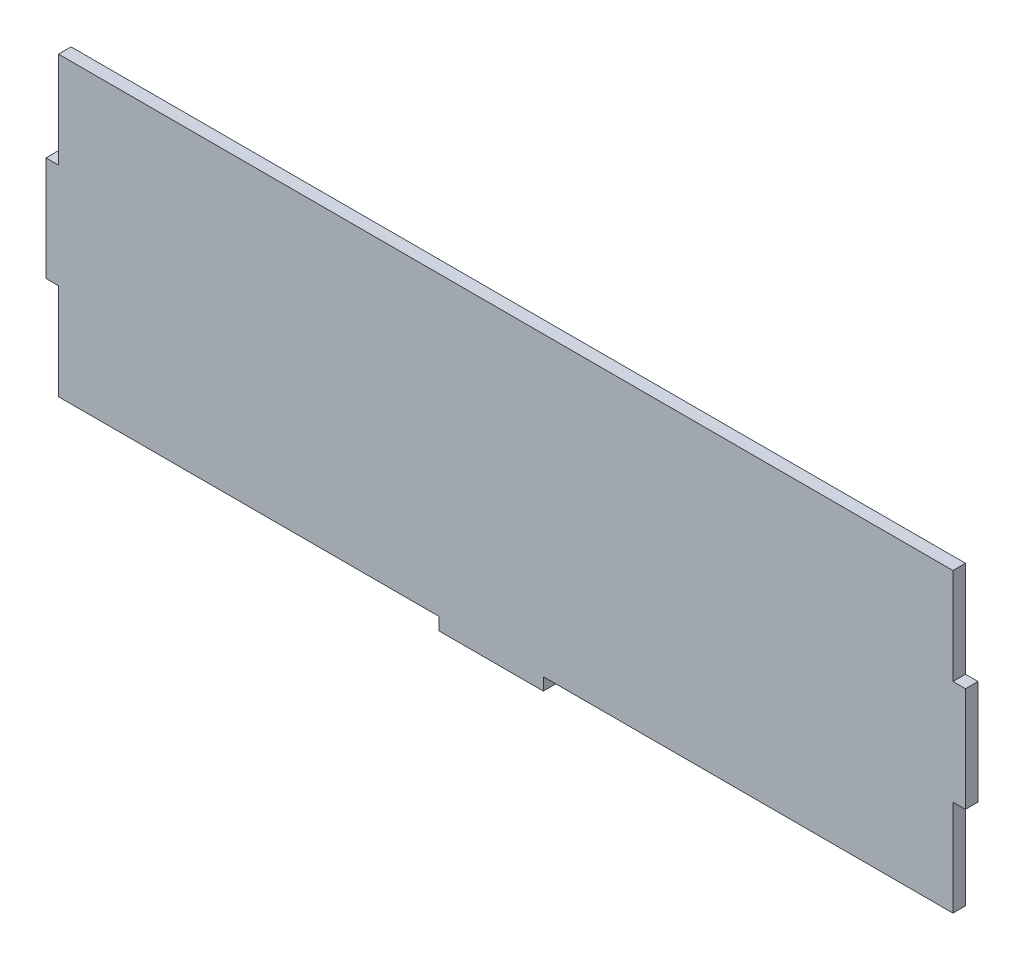
ISO-10303-21;
HEADER;
FILE_DESCRIPTION(('STEP AP214'),'2;1');
FILE_NAME('part.step','',(''),(''),'','','');
FILE_SCHEMA(('AUTOMOTIVE_DESIGN { 1 0 10303 214 1 1 1 1 }'));
ENDSEC;
DATA;
#1=APPLICATION_CONTEXT('core data for automotive mechanical design processes');
#2=APPLICATION_PROTOCOL_DEFINITION('international standard','automotive_design',2000,#1);
#3=PRODUCT_CONTEXT('',#1,'mechanical');
#4=PRODUCT('Part','Part','',(#3));
#5=PRODUCT_RELATED_PRODUCT_CATEGORY('part','',(#4));
#6=PRODUCT_DEFINITION_FORMATION('','',#4);
#7=PRODUCT_DEFINITION_CONTEXT('part definition',#1,'design');
#8=PRODUCT_DEFINITION('design','',#6,#7);
#9=PRODUCT_DEFINITION_SHAPE('','',#8);
#10=(LENGTH_UNIT() NAMED_UNIT(*) SI_UNIT(.MILLI.,.METRE.));
#11=(NAMED_UNIT(*) PLANE_ANGLE_UNIT() SI_UNIT($,.RADIAN.));
#12=(NAMED_UNIT(*) SI_UNIT($,.STERADIAN.) SOLID_ANGLE_UNIT());
#13=UNCERTAINTY_MEASURE_WITH_UNIT(LENGTH_MEASURE(1.E-05),#10,'distance_accuracy_value','');
#14=(GEOMETRIC_REPRESENTATION_CONTEXT(3) GLOBAL_UNCERTAINTY_ASSIGNED_CONTEXT((#13)) GLOBAL_UNIT_ASSIGNED_CONTEXT((#10,
#11,#12)) REPRESENTATION_CONTEXT('',''));
#15=CARTESIAN_POINT('',(0.,0.,0.));
#16=DIRECTION('',(0.,0.,1.));
#17=DIRECTION('',(1.,0.,0.));
#18=AXIS2_PLACEMENT_3D('',#15,#16,#17);
#19=CARTESIAN_POINT('',(0.,0.,6.));
#20=DIRECTION('',(1.,0.,0.));
#21=DIRECTION('',(0.,1.,0.));
#22=AXIS2_PLACEMENT_3D('',#19,#20,#21);
#23=PLANE('',#22);
#24=DIRECTION('',(0.,-1.,0.));
#25=VECTOR('',#24,1.);
#26=CARTESIAN_POINT('',(0.,0.,0.));
#27=LINE('',#26,#25);
#28=CARTESIAN_POINT('',(0.,0.,0.));
#29=VERTEX_POINT('',#28);
#30=CARTESIAN_POINT('',(0.,-46.,0.));
#31=VERTEX_POINT('',#30);
#32=EDGE_CURVE('E179',#29,#31,#27,.T.);
#33=ORIENTED_EDGE('',*,*,#32,.T.);
#34=DIRECTION('',(0.,0.,-1.));
#35=VECTOR('',#34,1.);
#36=CARTESIAN_POINT('',(0.,-46.,6.));
#37=LINE('',#36,#35);
#38=CARTESIAN_POINT('',(0.,-46.,6.));
#39=VERTEX_POINT('',#38);
#40=EDGE_CURVE('E11',#39,#31,#37,.T.);
#41=ORIENTED_EDGE('',*,*,#40,.F.);
#42=DIRECTION('',(0.,-1.,0.));
#43=VECTOR('',#42,1.);
#44=CARTESIAN_POINT('',(0.,0.,6.));
#45=LINE('',#44,#43);
#46=CARTESIAN_POINT('',(0.,0.,6.));
#47=VERTEX_POINT('',#46);
#48=EDGE_CURVE('E209',#47,#39,#45,.T.);
#49=ORIENTED_EDGE('',*,*,#48,.F.);
#50=DIRECTION('',(0.,0.,-1.));
#51=VECTOR('',#50,1.);
#52=CARTESIAN_POINT('',(0.,0.,6.));
#53=LINE('',#52,#51);
#54=EDGE_CURVE('E175',#47,#29,#53,.T.);
#55=ORIENTED_EDGE('',*,*,#54,.T.);
#56=EDGE_LOOP('',(#33,#41,#49,#55));
#57=FACE_BOUND('',#56,.T.);
#58=ADVANCED_FACE('F35',(#57),#23,.F.);
#59=CARTESIAN_POINT('',(-5.99999999999999,-46.,6.));
#60=DIRECTION('',(0.,-1.,0.));
#61=DIRECTION('',(0.,0.,-1.));
#62=AXIS2_PLACEMENT_3D('',#59,#60,#61);
#63=PLANE('',#62);
#64=DIRECTION('',(-1.,0.,0.));
#65=VECTOR('',#64,1.);
#66=CARTESIAN_POINT('',(-5.99999999999999,-46.,0.));
#67=LINE('',#66,#65);
#68=CARTESIAN_POINT('',(-5.99999999999999,-46.,0.));
#69=VERTEX_POINT('',#68);
#70=EDGE_CURVE('E182',#31,#69,#67,.T.);
#71=ORIENTED_EDGE('',*,*,#70,.T.);
#72=DIRECTION('',(0.,0.,-1.));
#73=VECTOR('',#72,1.);
#74=CARTESIAN_POINT('',(-5.99999999999999,-46.,6.));
#75=LINE('',#74,#73);
#76=CARTESIAN_POINT('',(-5.99999999999999,-46.,6.));
#77=VERTEX_POINT('',#76);
#78=EDGE_CURVE('E43',#77,#69,#75,.T.);
#79=ORIENTED_EDGE('',*,*,#78,.F.);
#80=DIRECTION('',(-1.,0.,0.));
#81=VECTOR('',#80,1.);
#82=CARTESIAN_POINT('',(-5.99999999999999,-46.,6.));
#83=LINE('',#82,#81);
#84=EDGE_CURVE('E118',#39,#77,#83,.T.);
#85=ORIENTED_EDGE('',*,*,#84,.F.);
#86=ORIENTED_EDGE('',*,*,#40,.T.);
#87=EDGE_LOOP('',(#71,#79,#85,#86));
#88=FACE_BOUND('',#87,.T.);
#89=ADVANCED_FACE('F307',(#88),#63,.F.);
#90=CARTESIAN_POINT('',(-5.99999999999999,-46.,6.));
#91=DIRECTION('',(1.,0.,0.));
#92=DIRECTION('',(0.,1.,0.));
#93=AXIS2_PLACEMENT_3D('',#90,#91,#92);
#94=PLANE('',#93);
#95=DIRECTION('',(0.,-1.,0.));
#96=VECTOR('',#95,1.);
#97=CARTESIAN_POINT('',(-5.99999999999999,-46.,0.));
#98=LINE('',#97,#96);
#99=CARTESIAN_POINT('',(-5.99999999999999,-96.,0.));
#100=VERTEX_POINT('',#99);
#101=EDGE_CURVE('E184',#69,#100,#98,.T.);
#102=ORIENTED_EDGE('',*,*,#101,.T.);
#103=DIRECTION('',(0.,0.,-1.));
#104=VECTOR('',#103,1.);
#105=CARTESIAN_POINT('',(-5.99999999999999,-96.,6.));
#106=LINE('',#105,#104);
#107=CARTESIAN_POINT('',(-5.99999999999999,-96.,6.));
#108=VERTEX_POINT('',#107);
#109=EDGE_CURVE('E240',#108,#100,#106,.T.);
#110=ORIENTED_EDGE('',*,*,#109,.F.);
#111=DIRECTION('',(0.,-1.,0.));
#112=VECTOR('',#111,1.);
#113=CARTESIAN_POINT('',(-5.99999999999999,-46.,6.));
#114=LINE('',#113,#112);
#115=EDGE_CURVE('E248',#77,#108,#114,.T.);
#116=ORIENTED_EDGE('',*,*,#115,.F.);
#117=ORIENTED_EDGE('',*,*,#78,.T.);
#118=EDGE_LOOP('',(#102,#110,#116,#117));
#119=FACE_BOUND('',#118,.T.);
#120=ADVANCED_FACE('F246',(#119),#94,.F.);
#121=CARTESIAN_POINT('',(-5.99999999999999,-96.,6.));
#122=DIRECTION('',(0.,1.,0.));
#123=DIRECTION('',(0.,0.,1.));
#124=AXIS2_PLACEMENT_3D('',#121,#122,#123);
#125=PLANE('',#124);
#126=DIRECTION('',(1.,0.,0.));
#127=VECTOR('',#126,1.);
#128=CARTESIAN_POINT('',(-5.99999999999999,-96.,0.));
#129=LINE('',#128,#127);
#130=CARTESIAN_POINT('',(0.,-96.,0.));
#131=VERTEX_POINT('',#130);
#132=EDGE_CURVE('E186',#100,#131,#129,.T.);
#133=ORIENTED_EDGE('',*,*,#132,.T.);
#134=DIRECTION('',(0.,0.,-1.));
#135=VECTOR('',#134,1.);
#136=CARTESIAN_POINT('',(0.,-96.,6.));
#137=LINE('',#136,#135);
#138=CARTESIAN_POINT('',(0.,-96.,6.));
#139=VERTEX_POINT('',#138);
#140=EDGE_CURVE('E237',#139,#131,#137,.T.);
#141=ORIENTED_EDGE('',*,*,#140,.F.);
#142=DIRECTION('',(1.,0.,0.));
#143=VECTOR('',#142,1.);
#144=CARTESIAN_POINT('',(-5.99999999999999,-96.,6.));
#145=LINE('',#144,#143);
#146=EDGE_CURVE('E266',#108,#139,#145,.T.);
#147=ORIENTED_EDGE('',*,*,#146,.F.);
#148=ORIENTED_EDGE('',*,*,#109,.T.);
#149=EDGE_LOOP('',(#133,#141,#147,#148));
#150=FACE_BOUND('',#149,.T.);
#151=ADVANCED_FACE('F257',(#150),#125,.F.);
#152=CARTESIAN_POINT('',(0.,-96.,6.));
#153=DIRECTION('',(1.,0.,0.));
#154=DIRECTION('',(0.,1.,0.));
#155=AXIS2_PLACEMENT_3D('',#152,#153,#154);
#156=PLANE('',#155);
#157=DIRECTION('',(0.,-1.,0.));
#158=VECTOR('',#157,1.);
#159=CARTESIAN_POINT('',(0.,-96.,0.));
#160=LINE('',#159,#158);
#161=CARTESIAN_POINT('',(0.,-142.,0.));
#162=VERTEX_POINT('',#161);
#163=EDGE_CURVE('E188',#131,#162,#160,.T.);
#164=ORIENTED_EDGE('',*,*,#163,.T.);
#165=DIRECTION('',(0.,0.,-1.));
#166=VECTOR('',#165,1.);
#167=CARTESIAN_POINT('',(0.,-142.,6.));
#168=LINE('',#167,#166);
#169=CARTESIAN_POINT('',(0.,-142.,6.));
#170=VERTEX_POINT('',#169);
#171=EDGE_CURVE('E234',#170,#162,#168,.T.);
#172=ORIENTED_EDGE('',*,*,#171,.F.);
#173=DIRECTION('',(0.,-1.,0.));
#174=VECTOR('',#173,1.);
#175=CARTESIAN_POINT('',(0.,-96.,6.));
#176=LINE('',#175,#174);
#177=EDGE_CURVE('E263',#139,#170,#176,.T.);
#178=ORIENTED_EDGE('',*,*,#177,.F.);
#179=ORIENTED_EDGE('',*,*,#140,.T.);
#180=EDGE_LOOP('',(#164,#172,#178,#179));
#181=FACE_BOUND('',#180,.T.);
#182=ADVANCED_FACE('F261',(#181),#156,.F.);
#183=CARTESIAN_POINT('',(182.,-142.,6.));
#184=DIRECTION('',(0.,1.,0.));
#185=DIRECTION('',(-1.,0.,0.));
#186=AXIS2_PLACEMENT_3D('',#183,#184,#185);
#187=PLANE('',#186);
#188=DIRECTION('',(1.,0.,0.));
#189=VECTOR('',#188,1.);
#190=CARTESIAN_POINT('',(182.,-142.,0.));
#191=LINE('',#190,#189);
#192=CARTESIAN_POINT('',(182.,-142.,0.));
#193=VERTEX_POINT('',#192);
#194=EDGE_CURVE('E190',#162,#193,#191,.T.);
#195=ORIENTED_EDGE('',*,*,#194,.T.);
#196=DIRECTION('',(0.,0.,-1.));
#197=VECTOR('',#196,1.);
#198=CARTESIAN_POINT('',(182.,-142.,6.));
#199=LINE('',#198,#197);
#200=CARTESIAN_POINT('',(182.,-142.,6.));
#201=VERTEX_POINT('',#200);
#202=EDGE_CURVE('E231',#201,#193,#199,.T.);
#203=ORIENTED_EDGE('',*,*,#202,.F.);
#204=DIRECTION('',(1.,0.,0.));
#205=VECTOR('',#204,1.);
#206=CARTESIAN_POINT('',(182.,-142.,6.));
#207=LINE('',#206,#205);
#208=EDGE_CURVE('E265',#170,#201,#207,.T.);
#209=ORIENTED_EDGE('',*,*,#208,.F.);
#210=ORIENTED_EDGE('',*,*,#171,.T.);
#211=EDGE_LOOP('',(#195,#203,#209,#210));
#212=FACE_BOUND('',#211,.T.);
#213=ADVANCED_FACE('F320',(#212),#187,.F.);
#214=CARTESIAN_POINT('',(182.,-142.,6.));
#215=DIRECTION('',(1.,0.,0.));
#216=DIRECTION('',(0.,1.,0.));
#217=AXIS2_PLACEMENT_3D('',#214,#215,#216);
#218=PLANE('',#217);
#219=DIRECTION('',(0.,-1.,0.));
#220=VECTOR('',#219,1.);
#221=CARTESIAN_POINT('',(182.,-142.,0.));
#222=LINE('',#221,#220);
#223=CARTESIAN_POINT('',(182.,-148.,0.));
#224=VERTEX_POINT('',#223);
#225=EDGE_CURVE('E192',#193,#224,#222,.T.);
#226=ORIENTED_EDGE('',*,*,#225,.T.);
#227=DIRECTION('',(0.,0.,-1.));
#228=VECTOR('',#227,1.);
#229=CARTESIAN_POINT('',(182.,-148.,6.));
#230=LINE('',#229,#228);
#231=CARTESIAN_POINT('',(182.,-148.,6.));
#232=VERTEX_POINT('',#231);
#233=EDGE_CURVE('E228',#232,#224,#230,.T.);
#234=ORIENTED_EDGE('',*,*,#233,.F.);
#235=DIRECTION('',(0.,-1.,0.));
#236=VECTOR('',#235,1.);
#237=CARTESIAN_POINT('',(182.,-142.,6.));
#238=LINE('',#237,#236);
#239=EDGE_CURVE('E268',#201,#232,#238,.T.);
#240=ORIENTED_EDGE('',*,*,#239,.F.);
#241=ORIENTED_EDGE('',*,*,#202,.T.);
#242=EDGE_LOOP('',(#226,#234,#240,#241));
#243=FACE_BOUND('',#242,.T.);
#244=ADVANCED_FACE('F323',(#243),#218,.F.);
#245=CARTESIAN_POINT('',(182.,-148.,6.));
#246=DIRECTION('',(0.,1.,0.));
#247=DIRECTION('',(0.,0.,1.));
#248=AXIS2_PLACEMENT_3D('',#245,#246,#247);
#249=PLANE('',#248);
#250=DIRECTION('',(1.,0.,0.));
#251=VECTOR('',#250,1.);
#252=CARTESIAN_POINT('',(182.,-148.,0.));
#253=LINE('',#252,#251);
#254=CARTESIAN_POINT('',(232.,-148.,0.));
#255=VERTEX_POINT('',#254);
#256=EDGE_CURVE('E194',#224,#255,#253,.T.);
#257=ORIENTED_EDGE('',*,*,#256,.T.);
#258=DIRECTION('',(0.,0.,-1.));
#259=VECTOR('',#258,1.);
#260=CARTESIAN_POINT('',(232.,-148.,6.));
#261=LINE('',#260,#259);
#262=CARTESIAN_POINT('',(232.,-148.,6.));
#263=VERTEX_POINT('',#262);
#264=EDGE_CURVE('E225',#263,#255,#261,.T.);
#265=ORIENTED_EDGE('',*,*,#264,.F.);
#266=DIRECTION('',(1.,0.,0.));
#267=VECTOR('',#266,1.);
#268=CARTESIAN_POINT('',(182.,-148.,6.));
#269=LINE('',#268,#267);
#270=EDGE_CURVE('E274',#232,#263,#269,.T.);
#271=ORIENTED_EDGE('',*,*,#270,.F.);
#272=ORIENTED_EDGE('',*,*,#233,.T.);
#273=EDGE_LOOP('',(#257,#265,#271,#272));
#274=FACE_BOUND('',#273,.T.);
#275=ADVANCED_FACE('F327',(#274),#249,.F.);
#276=CARTESIAN_POINT('',(232.,-142.,6.));
#277=DIRECTION('',(-1.,0.,0.));
#278=DIRECTION('',(0.,0.,1.));
#279=AXIS2_PLACEMENT_3D('',#276,#277,#278);
#280=PLANE('',#279);
#281=DIRECTION('',(0.,1.,0.));
#282=VECTOR('',#281,1.);
#283=CARTESIAN_POINT('',(232.,-142.,0.));
#284=LINE('',#283,#282);
#285=CARTESIAN_POINT('',(232.,-142.,0.));
#286=VERTEX_POINT('',#285);
#287=EDGE_CURVE('E196',#255,#286,#284,.T.);
#288=ORIENTED_EDGE('',*,*,#287,.T.);
#289=DIRECTION('',(0.,0.,-1.));
#290=VECTOR('',#289,1.);
#291=CARTESIAN_POINT('',(232.,-142.,6.));
#292=LINE('',#291,#290);
#293=CARTESIAN_POINT('',(232.,-142.,6.));
#294=VERTEX_POINT('',#293);
#295=EDGE_CURVE('E222',#294,#286,#292,.T.);
#296=ORIENTED_EDGE('',*,*,#295,.F.);
#297=DIRECTION('',(0.,1.,0.));
#298=VECTOR('',#297,1.);
#299=CARTESIAN_POINT('',(232.,-142.,6.));
#300=LINE('',#299,#298);
#301=EDGE_CURVE('E276',#263,#294,#300,.T.);
#302=ORIENTED_EDGE('',*,*,#301,.F.);
#303=ORIENTED_EDGE('',*,*,#264,.T.);
#304=EDGE_LOOP('',(#288,#296,#302,#303));
#305=FACE_BOUND('',#304,.T.);
#306=ADVANCED_FACE('F331',(#305),#280,.F.);
#307=CARTESIAN_POINT('',(428.,-142.,6.));
#308=DIRECTION('',(0.,1.,0.));
#309=DIRECTION('',(-1.,0.,0.));
#310=AXIS2_PLACEMENT_3D('',#307,#308,#309);
#311=PLANE('',#310);
#312=DIRECTION('',(1.,0.,0.));
#313=VECTOR('',#312,1.);
#314=CARTESIAN_POINT('',(428.,-142.,0.));
#315=LINE('',#314,#313);
#316=CARTESIAN_POINT('',(428.,-142.,0.));
#317=VERTEX_POINT('',#316);
#318=EDGE_CURVE('E198',#286,#317,#315,.T.);
#319=ORIENTED_EDGE('',*,*,#318,.T.);
#320=DIRECTION('',(0.,0.,-1.));
#321=VECTOR('',#320,1.);
#322=CARTESIAN_POINT('',(428.,-142.,6.));
#323=LINE('',#322,#321);
#324=CARTESIAN_POINT('',(428.,-142.,6.));
#325=VERTEX_POINT('',#324);
#326=EDGE_CURVE('E219',#325,#317,#323,.T.);
#327=ORIENTED_EDGE('',*,*,#326,.F.);
#328=DIRECTION('',(1.,0.,0.));
#329=VECTOR('',#328,1.);
#330=CARTESIAN_POINT('',(428.,-142.,6.));
#331=LINE('',#330,#329);
#332=EDGE_CURVE('E278',#294,#325,#331,.T.);
#333=ORIENTED_EDGE('',*,*,#332,.F.);
#334=ORIENTED_EDGE('',*,*,#295,.T.);
#335=EDGE_LOOP('',(#319,#327,#333,#334));
#336=FACE_BOUND('',#335,.T.);
#337=ADVANCED_FACE('F335',(#336),#311,.F.);
#338=CARTESIAN_POINT('',(428.,-95.9999999999999,6.));
#339=DIRECTION('',(-1.,0.,0.));
#340=DIRECTION('',(0.,0.,1.));
#341=AXIS2_PLACEMENT_3D('',#338,#339,#340);
#342=PLANE('',#341);
#343=DIRECTION('',(0.,1.,0.));
#344=VECTOR('',#343,1.);
#345=CARTESIAN_POINT('',(428.,-95.9999999999999,0.));
#346=LINE('',#345,#344);
#347=CARTESIAN_POINT('',(428.,-95.9999999999999,0.));
#348=VERTEX_POINT('',#347);
#349=EDGE_CURVE('E200',#317,#348,#346,.T.);
#350=ORIENTED_EDGE('',*,*,#349,.T.);
#351=DIRECTION('',(0.,0.,-1.));
#352=VECTOR('',#351,1.);
#353=CARTESIAN_POINT('',(428.,-95.9999999999999,6.));
#354=LINE('',#353,#352);
#355=CARTESIAN_POINT('',(428.,-95.9999999999999,6.));
#356=VERTEX_POINT('',#355);
#357=EDGE_CURVE('E216',#356,#348,#354,.T.);
#358=ORIENTED_EDGE('',*,*,#357,.F.);
#359=DIRECTION('',(0.,1.,0.));
#360=VECTOR('',#359,1.);
#361=CARTESIAN_POINT('',(428.,-95.9999999999999,6.));
#362=LINE('',#361,#360);
#363=EDGE_CURVE('E280',#325,#356,#362,.T.);
#364=ORIENTED_EDGE('',*,*,#363,.F.);
#365=ORIENTED_EDGE('',*,*,#326,.T.);
#366=EDGE_LOOP('',(#350,#358,#364,#365));
#367=FACE_BOUND('',#366,.T.);
#368=ADVANCED_FACE('F339',(#367),#342,.F.);
#369=CARTESIAN_POINT('',(434.,-95.9999999999999,6.));
#370=DIRECTION('',(0.,1.,0.));
#371=DIRECTION('',(0.,0.,1.));
#372=AXIS2_PLACEMENT_3D('',#369,#370,#371);
#373=PLANE('',#372);
#374=DIRECTION('',(1.,0.,0.));
#375=VECTOR('',#374,1.);
#376=CARTESIAN_POINT('',(434.,-95.9999999999999,0.));
#377=LINE('',#376,#375);
#378=CARTESIAN_POINT('',(434.,-95.9999999999999,0.));
#379=VERTEX_POINT('',#378);
#380=EDGE_CURVE('E202',#348,#379,#377,.T.);
#381=ORIENTED_EDGE('',*,*,#380,.T.);
#382=DIRECTION('',(0.,0.,-1.));
#383=VECTOR('',#382,1.);
#384=CARTESIAN_POINT('',(434.,-95.9999999999999,6.));
#385=LINE('',#384,#383);
#386=CARTESIAN_POINT('',(434.,-95.9999999999999,6.));
#387=VERTEX_POINT('',#386);
#388=EDGE_CURVE('E213',#387,#379,#385,.T.);
#389=ORIENTED_EDGE('',*,*,#388,.F.);
#390=DIRECTION('',(1.,0.,0.));
#391=VECTOR('',#390,1.);
#392=CARTESIAN_POINT('',(434.,-95.9999999999999,6.));
#393=LINE('',#392,#391);
#394=EDGE_CURVE('E282',#356,#387,#393,.T.);
#395=ORIENTED_EDGE('',*,*,#394,.F.);
#396=ORIENTED_EDGE('',*,*,#357,.T.);
#397=EDGE_LOOP('',(#381,#389,#395,#396));
#398=FACE_BOUND('',#397,.T.);
#399=ADVANCED_FACE('F288',(#398),#373,.F.);
#400=CARTESIAN_POINT('',(434.,-45.9999999999999,6.));
#401=DIRECTION('',(-1.,0.,0.));
#402=DIRECTION('',(0.,-1.,0.));
#403=AXIS2_PLACEMENT_3D('',#400,#401,#402);
#404=PLANE('',#403);
#405=DIRECTION('',(0.,1.,0.));
#406=VECTOR('',#405,1.);
#407=CARTESIAN_POINT('',(434.,-45.9999999999999,0.));
#408=LINE('',#407,#406);
#409=CARTESIAN_POINT('',(434.,-45.9999999999999,0.));
#410=VERTEX_POINT('',#409);
#411=EDGE_CURVE('E204',#379,#410,#408,.T.);
#412=ORIENTED_EDGE('',*,*,#411,.T.);
#413=DIRECTION('',(0.,0.,-1.));
#414=VECTOR('',#413,1.);
#415=CARTESIAN_POINT('',(434.,-45.9999999999999,6.));
#416=LINE('',#415,#414);
#417=CARTESIAN_POINT('',(434.,-45.9999999999999,6.));
#418=VERTEX_POINT('',#417);
#419=EDGE_CURVE('E170',#418,#410,#416,.T.);
#420=ORIENTED_EDGE('',*,*,#419,.F.);
#421=DIRECTION('',(0.,1.,0.));
#422=VECTOR('',#421,1.);
#423=CARTESIAN_POINT('',(434.,-45.9999999999999,6.));
#424=LINE('',#423,#422);
#425=EDGE_CURVE('E161',#387,#418,#424,.T.);
#426=ORIENTED_EDGE('',*,*,#425,.F.);
#427=ORIENTED_EDGE('',*,*,#388,.T.);
#428=EDGE_LOOP('',(#412,#420,#426,#427));
#429=FACE_BOUND('',#428,.T.);
#430=ADVANCED_FACE('F292',(#429),#404,.F.);
#431=CARTESIAN_POINT('',(434.,-45.9999999999999,6.));
#432=DIRECTION('',(0.,-1.,0.));
#433=DIRECTION('',(0.,0.,-1.));
#434=AXIS2_PLACEMENT_3D('',#431,#432,#433);
#435=PLANE('',#434);
#436=DIRECTION('',(-1.,0.,0.));
#437=VECTOR('',#436,1.);
#438=CARTESIAN_POINT('',(434.,-45.9999999999999,0.));
#439=LINE('',#438,#437);
#440=CARTESIAN_POINT('',(428.,-45.9999999999999,0.));
#441=VERTEX_POINT('',#440);
#442=EDGE_CURVE('E169',#410,#441,#439,.T.);
#443=ORIENTED_EDGE('',*,*,#442,.T.);
#444=DIRECTION('',(0.,0.,-1.));
#445=VECTOR('',#444,1.);
#446=CARTESIAN_POINT('',(428.,-45.9999999999999,6.));
#447=LINE('',#446,#445);
#448=CARTESIAN_POINT('',(428.,-45.9999999999999,6.));
#449=VERTEX_POINT('',#448);
#450=EDGE_CURVE('E166',#449,#441,#447,.T.);
#451=ORIENTED_EDGE('',*,*,#450,.F.);
#452=DIRECTION('',(-1.,0.,0.));
#453=VECTOR('',#452,1.);
#454=CARTESIAN_POINT('',(434.,-45.9999999999999,6.));
#455=LINE('',#454,#453);
#456=EDGE_CURVE('E155',#418,#449,#455,.T.);
#457=ORIENTED_EDGE('',*,*,#456,.F.);
#458=ORIENTED_EDGE('',*,*,#419,.T.);
#459=EDGE_LOOP('',(#443,#451,#457,#458));
#460=FACE_BOUND('',#459,.T.);
#461=ADVANCED_FACE('F167',(#460),#435,.F.);
#462=CARTESIAN_POINT('',(428.,0.,6.));
#463=DIRECTION('',(-1.,0.,0.));
#464=DIRECTION('',(0.,0.,1.));
#465=AXIS2_PLACEMENT_3D('',#462,#463,#464);
#466=PLANE('',#465);
#467=DIRECTION('',(0.,1.,0.));
#468=VECTOR('',#467,1.);
#469=CARTESIAN_POINT('',(428.,0.,0.));
#470=LINE('',#469,#468);
#471=CARTESIAN_POINT('',(428.,0.,0.));
#472=VERTEX_POINT('',#471);
#473=EDGE_CURVE('E104',#441,#472,#470,.T.);
#474=ORIENTED_EDGE('',*,*,#473,.T.);
#475=DIRECTION('',(0.,0.,-1.));
#476=VECTOR('',#475,1.);
#477=CARTESIAN_POINT('',(428.,0.,6.));
#478=LINE('',#477,#476);
#479=CARTESIAN_POINT('',(428.,0.,6.));
#480=VERTEX_POINT('',#479);
#481=EDGE_CURVE('E171',#480,#472,#478,.T.);
#482=ORIENTED_EDGE('',*,*,#481,.F.);
#483=DIRECTION('',(0.,1.,0.));
#484=VECTOR('',#483,1.);
#485=CARTESIAN_POINT('',(428.,0.,6.));
#486=LINE('',#485,#484);
#487=EDGE_CURVE('E159',#449,#480,#486,.T.);
#488=ORIENTED_EDGE('',*,*,#487,.F.);
#489=ORIENTED_EDGE('',*,*,#450,.T.);
#490=EDGE_LOOP('',(#474,#482,#488,#489));
#491=FACE_BOUND('',#490,.T.);
#492=ADVANCED_FACE('F173',(#491),#466,.F.);
#493=CARTESIAN_POINT('',(0.,0.,6.));
#494=DIRECTION('',(0.,-1.,0.));
#495=DIRECTION('',(1.,0.,0.));
#496=AXIS2_PLACEMENT_3D('',#493,#494,#495);
#497=PLANE('',#496);
#498=DIRECTION('',(-1.,0.,0.));
#499=VECTOR('',#498,1.);
#500=CARTESIAN_POINT('',(0.,0.,0.));
#501=LINE('',#500,#499);
#502=EDGE_CURVE('E110',#472,#29,#501,.T.);
#503=ORIENTED_EDGE('',*,*,#502,.T.);
#504=ORIENTED_EDGE('',*,*,#54,.F.);
#505=DIRECTION('',(-1.,0.,0.));
#506=VECTOR('',#505,1.);
#507=CARTESIAN_POINT('',(0.,0.,6.));
#508=LINE('',#507,#506);
#509=EDGE_CURVE('E51',#480,#47,#508,.T.);
#510=ORIENTED_EDGE('',*,*,#509,.F.);
#511=ORIENTED_EDGE('',*,*,#481,.T.);
#512=EDGE_LOOP('',(#503,#504,#510,#511));
#513=FACE_BOUND('',#512,.T.);
#514=ADVANCED_FACE('F296',(#513),#497,.F.);
#515=CARTESIAN_POINT('',(0.,0.,6.));
#516=DIRECTION('',(0.,0.,1.));
#517=DIRECTION('',(1.,0.,0.));
#518=AXIS2_PLACEMENT_3D('',#515,#516,#517);
#519=PLANE('',#518);
#520=ORIENTED_EDGE('',*,*,#48,.T.);
#521=ORIENTED_EDGE('',*,*,#84,.T.);
#522=ORIENTED_EDGE('',*,*,#115,.T.);
#523=ORIENTED_EDGE('',*,*,#146,.T.);
#524=ORIENTED_EDGE('',*,*,#177,.T.);
#525=ORIENTED_EDGE('',*,*,#208,.T.);
#526=ORIENTED_EDGE('',*,*,#239,.T.);
#527=ORIENTED_EDGE('',*,*,#270,.T.);
#528=ORIENTED_EDGE('',*,*,#301,.T.);
#529=ORIENTED_EDGE('',*,*,#332,.T.);
#530=ORIENTED_EDGE('',*,*,#363,.T.);
#531=ORIENTED_EDGE('',*,*,#394,.T.);
#532=ORIENTED_EDGE('',*,*,#425,.T.);
#533=ORIENTED_EDGE('',*,*,#456,.T.);
#534=ORIENTED_EDGE('',*,*,#487,.T.);
#535=ORIENTED_EDGE('',*,*,#509,.T.);
#536=EDGE_LOOP('',(#520,#521,#522,#523,#524,#525,#526,#527,#528,#529,#530,#531,#532,#533,#534,#535));
#537=FACE_BOUND('',#536,.T.);
#538=ADVANCED_FACE('F157',(#537),#519,.T.);
#539=CARTESIAN_POINT('',(0.,0.,0.));
#540=DIRECTION('',(0.,0.,1.));
#541=DIRECTION('',(1.,0.,0.));
#542=AXIS2_PLACEMENT_3D('',#539,#540,#541);
#543=PLANE('',#542);
#544=ORIENTED_EDGE('',*,*,#32,.F.);
#545=ORIENTED_EDGE('',*,*,#502,.F.);
#546=ORIENTED_EDGE('',*,*,#473,.F.);
#547=ORIENTED_EDGE('',*,*,#442,.F.);
#548=ORIENTED_EDGE('',*,*,#411,.F.);
#549=ORIENTED_EDGE('',*,*,#380,.F.);
#550=ORIENTED_EDGE('',*,*,#349,.F.);
#551=ORIENTED_EDGE('',*,*,#318,.F.);
#552=ORIENTED_EDGE('',*,*,#287,.F.);
#553=ORIENTED_EDGE('',*,*,#256,.F.);
#554=ORIENTED_EDGE('',*,*,#225,.F.);
#555=ORIENTED_EDGE('',*,*,#194,.F.);
#556=ORIENTED_EDGE('',*,*,#163,.F.);
#557=ORIENTED_EDGE('',*,*,#132,.F.);
#558=ORIENTED_EDGE('',*,*,#101,.F.);
#559=ORIENTED_EDGE('',*,*,#70,.F.);
#560=EDGE_LOOP('',(#544,#545,#546,#547,#548,#549,#550,#551,#552,#553,#554,#555,#556,#557,#558,#559));
#561=FACE_BOUND('',#560,.T.);
#562=ADVANCED_FACE('F252',(#561),#543,.F.);
#563=CLOSED_SHELL('',(#58,#89,#120,#151,#182,#213,#244,#275,#306,#337,#368,#399,#430,#461,#492,
#514,#538,#562));
#564=MANIFOLD_SOLID_BREP('B2',#563);
#565=ADVANCED_BREP_SHAPE_REPRESENTATION('',(#18,#564),#14);
#566=SHAPE_DEFINITION_REPRESENTATION(#9,#565);
ENDSEC;
END-ISO-10303-21;
